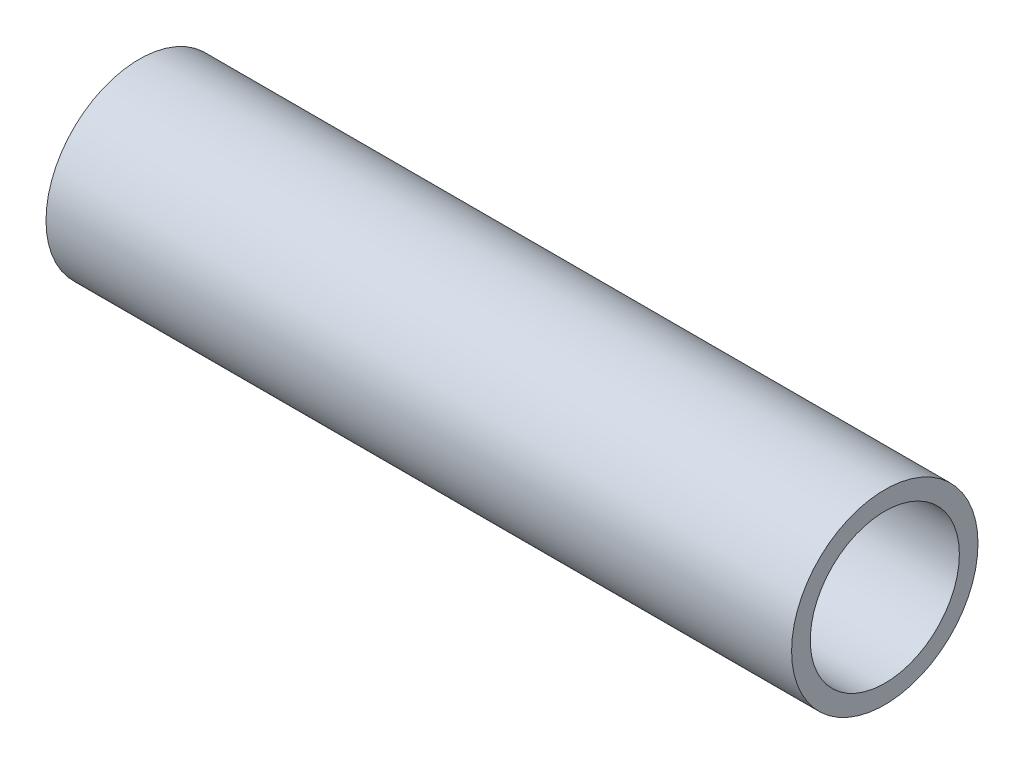
ISO-10303-21;
HEADER;
FILE_DESCRIPTION(('STEP AP214'),'2;1');
FILE_NAME('part.step','',(''),(''),'','','');
FILE_SCHEMA(('AUTOMOTIVE_DESIGN { 1 0 10303 214 1 1 1 1 }'));
ENDSEC;
DATA;
#1=APPLICATION_CONTEXT('core data for automotive mechanical design processes');
#2=APPLICATION_PROTOCOL_DEFINITION('international standard','automotive_design',2000,#1);
#3=PRODUCT_CONTEXT('',#1,'mechanical');
#4=PRODUCT('Part','Part','',(#3));
#5=PRODUCT_RELATED_PRODUCT_CATEGORY('part','',(#4));
#6=PRODUCT_DEFINITION_FORMATION('','',#4);
#7=PRODUCT_DEFINITION_CONTEXT('part definition',#1,'design');
#8=PRODUCT_DEFINITION('design','',#6,#7);
#9=PRODUCT_DEFINITION_SHAPE('','',#8);
#10=(LENGTH_UNIT() NAMED_UNIT(*) SI_UNIT(.MILLI.,.METRE.));
#11=(NAMED_UNIT(*) PLANE_ANGLE_UNIT() SI_UNIT($,.RADIAN.));
#12=(NAMED_UNIT(*) SI_UNIT($,.STERADIAN.) SOLID_ANGLE_UNIT());
#13=UNCERTAINTY_MEASURE_WITH_UNIT(LENGTH_MEASURE(1.E-05),#10,'distance_accuracy_value','');
#14=(GEOMETRIC_REPRESENTATION_CONTEXT(3) GLOBAL_UNCERTAINTY_ASSIGNED_CONTEXT((#13)) GLOBAL_UNIT_ASSIGNED_CONTEXT((#10,
#11,#12)) REPRESENTATION_CONTEXT('',''));
#15=CARTESIAN_POINT('',(0.,0.,0.));
#16=DIRECTION('',(0.,0.,1.));
#17=DIRECTION('',(1.,0.,0.));
#18=AXIS2_PLACEMENT_3D('',#15,#16,#17);
#19=CARTESIAN_POINT('',(5.,0.,0.));
#20=DIRECTION('',(1.,0.,0.));
#21=DIRECTION('',(0.,0.,-1.));
#22=AXIS2_PLACEMENT_3D('',#19,#20,#21);
#23=PLANE('',#22);
#24=CARTESIAN_POINT('',(5.,0.,0.));
#25=DIRECTION('',(1.,0.,0.));
#26=DIRECTION('',(0.,0.,-1.));
#27=AXIS2_PLACEMENT_3D('',#24,#25,#26);
#28=CIRCLE('',#27,1.25);
#29=CARTESIAN_POINT('',(5.,0.,-1.25));
#30=VERTEX_POINT('',#29);
#31=EDGE_CURVE('E12',#30,#30,#28,.T.);
#32=ORIENTED_EDGE('',*,*,#31,.T.);
#33=EDGE_LOOP('',(#32));
#34=FACE_BOUND('',#33,.T.);
#35=CARTESIAN_POINT('',(5.,0.,0.));
#36=DIRECTION('',(1.,0.,0.));
#37=DIRECTION('',(0.,0.,-1.));
#38=AXIS2_PLACEMENT_3D('',#35,#36,#37);
#39=CIRCLE('',#38,1.);
#40=CARTESIAN_POINT('',(5.,0.,-1.));
#41=VERTEX_POINT('',#40);
#42=EDGE_CURVE('E52',#41,#41,#39,.T.);
#43=ORIENTED_EDGE('',*,*,#42,.F.);
#44=EDGE_LOOP('',(#43));
#45=FACE_BOUND('',#44,.T.);
#46=ADVANCED_FACE('F41',(#34,#45),#23,.T.);
#47=CARTESIAN_POINT('',(-5.,0.,0.));
#48=DIRECTION('',(1.,0.,0.));
#49=DIRECTION('',(0.,0.,-1.));
#50=AXIS2_PLACEMENT_3D('',#47,#48,#49);
#51=PLANE('',#50);
#52=CARTESIAN_POINT('',(-5.,0.,0.));
#53=DIRECTION('',(1.,0.,0.));
#54=DIRECTION('',(0.,0.,-1.));
#55=AXIS2_PLACEMENT_3D('',#52,#53,#54);
#56=CIRCLE('',#55,1.25);
#57=CARTESIAN_POINT('',(-5.,0.,-1.25));
#58=VERTEX_POINT('',#57);
#59=EDGE_CURVE('E45',#58,#58,#56,.T.);
#60=ORIENTED_EDGE('',*,*,#59,.F.);
#61=EDGE_LOOP('',(#60));
#62=FACE_BOUND('',#61,.T.);
#63=CARTESIAN_POINT('',(-5.,0.,0.));
#64=DIRECTION('',(1.,0.,0.));
#65=DIRECTION('',(0.,0.,-1.));
#66=AXIS2_PLACEMENT_3D('',#63,#64,#65);
#67=CIRCLE('',#66,1.);
#68=CARTESIAN_POINT('',(-5.,0.,-1.));
#69=VERTEX_POINT('',#68);
#70=EDGE_CURVE('E54',#69,#69,#67,.T.);
#71=ORIENTED_EDGE('',*,*,#70,.T.);
#72=EDGE_LOOP('',(#71));
#73=FACE_BOUND('',#72,.T.);
#74=ADVANCED_FACE('F64',(#62,#73),#51,.F.);
#75=CARTESIAN_POINT('',(5.,0.,0.));
#76=DIRECTION('',(-1.,0.,0.));
#77=DIRECTION('',(0.,0.,1.));
#78=AXIS2_PLACEMENT_3D('',#75,#76,#77);
#79=CYLINDRICAL_SURFACE('',#78,1.25);
#80=ORIENTED_EDGE('',*,*,#31,.F.);
#81=EDGE_LOOP('',(#80));
#82=FACE_BOUND('',#81,.T.);
#83=ORIENTED_EDGE('',*,*,#59,.T.);
#84=EDGE_LOOP('',(#83));
#85=FACE_BOUND('',#84,.T.);
#86=ADVANCED_FACE('F43',(#82,#85),#79,.T.);
#87=CARTESIAN_POINT('',(5.,0.,0.));
#88=DIRECTION('',(-1.,0.,0.));
#89=DIRECTION('',(0.,0.,1.));
#90=AXIS2_PLACEMENT_3D('',#87,#88,#89);
#91=CYLINDRICAL_SURFACE('',#90,1.);
#92=ORIENTED_EDGE('',*,*,#42,.T.);
#93=EDGE_LOOP('',(#92));
#94=FACE_BOUND('',#93,.T.);
#95=ORIENTED_EDGE('',*,*,#70,.F.);
#96=EDGE_LOOP('',(#95));
#97=FACE_BOUND('',#96,.T.);
#98=ADVANCED_FACE('F60',(#94,#97),#91,.F.);
#99=CLOSED_SHELL('',(#46,#74,#86,#98));
#100=MANIFOLD_SOLID_BREP('B2',#99);
#101=ADVANCED_BREP_SHAPE_REPRESENTATION('',(#18,#100),#14);
#102=SHAPE_DEFINITION_REPRESENTATION(#9,#101);
ENDSEC;
END-ISO-10303-21;
